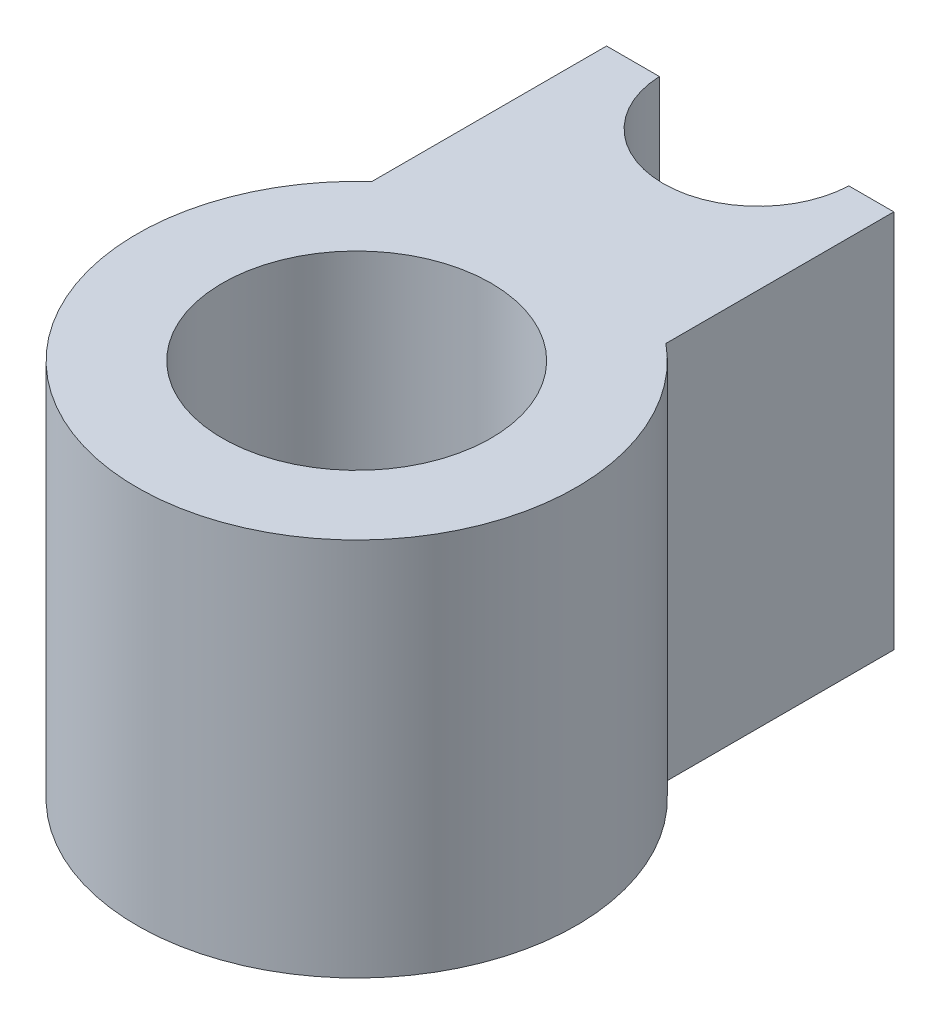
ISO-10303-21;
HEADER;
FILE_DESCRIPTION(('STEP AP214'),'2;1');
FILE_NAME('part.step','',(''),(''),'','','');
FILE_SCHEMA(('AUTOMOTIVE_DESIGN { 1 0 10303 214 1 1 1 1 }'));
ENDSEC;
DATA;
#1=APPLICATION_CONTEXT('core data for automotive mechanical design processes');
#2=APPLICATION_PROTOCOL_DEFINITION('international standard','automotive_design',2000,#1);
#3=PRODUCT_CONTEXT('',#1,'mechanical');
#4=PRODUCT('Part','Part','',(#3));
#5=PRODUCT_RELATED_PRODUCT_CATEGORY('part','',(#4));
#6=PRODUCT_DEFINITION_FORMATION('','',#4);
#7=PRODUCT_DEFINITION_CONTEXT('part definition',#1,'design');
#8=PRODUCT_DEFINITION('design','',#6,#7);
#9=PRODUCT_DEFINITION_SHAPE('','',#8);
#10=(LENGTH_UNIT() NAMED_UNIT(*) SI_UNIT(.MILLI.,.METRE.));
#11=(NAMED_UNIT(*) PLANE_ANGLE_UNIT() SI_UNIT($,.RADIAN.));
#12=(NAMED_UNIT(*) SI_UNIT($,.STERADIAN.) SOLID_ANGLE_UNIT());
#13=UNCERTAINTY_MEASURE_WITH_UNIT(LENGTH_MEASURE(1.E-05),#10,'distance_accuracy_value','');
#14=(GEOMETRIC_REPRESENTATION_CONTEXT(3) GLOBAL_UNCERTAINTY_ASSIGNED_CONTEXT((#13)) GLOBAL_UNIT_ASSIGNED_CONTEXT((#10,
#11,#12)) REPRESENTATION_CONTEXT('',''));
#15=CARTESIAN_POINT('',(0.,0.,0.));
#16=DIRECTION('',(0.,0.,1.));
#17=DIRECTION('',(1.,0.,0.));
#18=AXIS2_PLACEMENT_3D('',#15,#16,#17);
#19=CARTESIAN_POINT('',(1.26536763995187,2.87183105039429,15.59112871048));
#20=DIRECTION('',(0.,1.,0.));
#21=DIRECTION('',(0.,0.,-1.));
#22=AXIS2_PLACEMENT_3D('',#19,#20,#21);
#23=PLANE('',#22);
#24=CARTESIAN_POINT('',(8.79646763995186,2.87183105039428,7.9584287104753));
#25=DIRECTION('',(0.,1.,0.));
#26=DIRECTION('',(0.,0.,1.));
#27=AXIS2_PLACEMENT_3D('',#24,#25,#26);
#28=CIRCLE('',#27,0.425);
#29=CARTESIAN_POINT('',(8.79646763995187,2.87183105039428,7.5334287104753));
#30=VERTEX_POINT('',#29);
#31=EDGE_CURVE('E86',#30,#30,#28,.T.);
#32=ORIENTED_EDGE('',*,*,#31,.F.);
#33=EDGE_LOOP('',(#32));
#34=FACE_BOUND('',#33,.T.);
#35=DIRECTION('',(-5.02522919053297E-13,0.,1.));
#36=VECTOR('',#35,1.);
#37=CARTESIAN_POINT('',(8.32965283606923,2.87183105039428,6.70112871047543));
#38=LINE('',#37,#36);
#39=CARTESIAN_POINT('',(8.32965283606923,2.87183105039428,6.70112871047543));
#40=VERTEX_POINT('',#39);
#41=CARTESIAN_POINT('',(8.32965283606885,2.87183105039428,7.44378108328629));
#42=VERTEX_POINT('',#41);
#43=EDGE_CURVE('E101',#40,#42,#38,.T.);
#44=ORIENTED_EDGE('',*,*,#43,.T.);
#45=CARTESIAN_POINT('',(8.79646763995186,2.87183105039428,7.9584287104753));
#46=DIRECTION('',(0.,1.,0.));
#47=DIRECTION('',(0.,0.,1.));
#48=AXIS2_PLACEMENT_3D('',#45,#46,#47);
#49=CIRCLE('',#48,0.694822453073876);
#50=CARTESIAN_POINT('',(9.23834672883134,2.87183105039428,7.42221875895757));
#51=VERTEX_POINT('',#50);
#52=EDGE_CURVE('E99',#42,#51,#49,.T.);
#53=ORIENTED_EDGE('',*,*,#52,.T.);
#54=DIRECTION('',(5.6636748734305E-13,0.,1.));
#55=VECTOR('',#54,1.);
#56=CARTESIAN_POINT('',(9.23834672883093,2.87183105039428,6.70112871047504));
#57=LINE('',#56,#55);
#58=CARTESIAN_POINT('',(9.23834672883093,2.87183105039428,6.70112871047504));
#59=VERTEX_POINT('',#58);
#60=EDGE_CURVE('E26',#59,#51,#57,.T.);
#61=ORIENTED_EDGE('',*,*,#60,.F.);
#62=DIRECTION('',(-1.,0.,1.62432664225037E-12));
#63=VECTOR('',#62,1.);
#64=CARTESIAN_POINT('',(9.23834672883093,2.87183105039428,6.70112871047504));
#65=LINE('',#64,#63);
#66=CARTESIAN_POINT('',(9.0961987027398,2.87183105039428,6.70112871047519));
#67=VERTEX_POINT('',#66);
#68=EDGE_CURVE('E11',#59,#67,#65,.T.);
#69=ORIENTED_EDGE('',*,*,#68,.T.);
#70=CARTESIAN_POINT('',(8.79646763995185,2.87183105039428,6.68842871047528));
#71=DIRECTION('',(0.,1.,0.));
#72=DIRECTION('',(-0.999103542626486,0.,0.0423333333344553));
#73=AXIS2_PLACEMENT_3D('',#70,#71,#72);
#74=CIRCLE('',#73,0.299999999999992);
#75=CARTESIAN_POINT('',(8.49673657716391,2.87183105039428,6.70112871047561));
#76=VERTEX_POINT('',#75);
#77=EDGE_CURVE('E107',#76,#67,#74,.T.);
#78=ORIENTED_EDGE('',*,*,#77,.F.);
#79=DIRECTION('',(1.,0.,1.06337566312106E-12));
#80=VECTOR('',#79,1.);
#81=CARTESIAN_POINT('',(8.32965283606923,2.87183105039428,6.70112871047543));
#82=LINE('',#81,#80);
#83=EDGE_CURVE('E118',#40,#76,#82,.T.);
#84=ORIENTED_EDGE('',*,*,#83,.F.);
#85=EDGE_LOOP('',(#44,#53,#61,#69,#78,#84));
#86=FACE_BOUND('',#85,.T.);
#87=ADVANCED_FACE('F17',(#34,#86),#23,.T.);
#88=CARTESIAN_POINT('',(9.0961987027398,2.87183105039428,6.70112871047527));
#89=DIRECTION('',(-1.62432664225037E-12,0.,-1.));
#90=DIRECTION('',(-1.,0.,1.62432664225037E-12));
#91=AXIS2_PLACEMENT_3D('',#88,#89,#90);
#92=PLANE('',#91);
#93=DIRECTION('',(-1.,0.,1.62432664225037E-12));
#94=VECTOR('',#93,1.);
#95=CARTESIAN_POINT('',(5.18078317133862,1.6718310055699,6.70112871048163));
#96=LINE('',#95,#94);
#97=CARTESIAN_POINT('',(9.23834672883094,1.6718310055699,6.70112871047504));
#98=VERTEX_POINT('',#97);
#99=CARTESIAN_POINT('',(9.09619870273981,1.6718310055699,6.70112871047519));
#100=VERTEX_POINT('',#99);
#101=EDGE_CURVE('E159',#98,#100,#96,.T.);
#102=ORIENTED_EDGE('',*,*,#101,.T.);
#103=DIRECTION('',(0.,-1.,0.));
#104=VECTOR('',#103,1.);
#105=CARTESIAN_POINT('',(9.0961987027398,2.87183105039428,6.70112871047519));
#106=LINE('',#105,#104);
#107=EDGE_CURVE('E111',#67,#100,#106,.T.);
#108=ORIENTED_EDGE('',*,*,#107,.F.);
#109=ORIENTED_EDGE('',*,*,#68,.F.);
#110=DIRECTION('',(0.,-1.,0.));
#111=VECTOR('',#110,1.);
#112=CARTESIAN_POINT('',(9.23834672883093,2.87183105039428,6.70112871047504));
#113=LINE('',#112,#111);
#114=EDGE_CURVE('E127',#59,#98,#113,.T.);
#115=ORIENTED_EDGE('',*,*,#114,.T.);
#116=EDGE_LOOP('',(#102,#108,#109,#115));
#117=FACE_BOUND('',#116,.T.);
#118=ADVANCED_FACE('F193',(#117),#92,.T.);
#119=CARTESIAN_POINT('',(9.23834672883093,2.87183105039428,6.70112871047504));
#120=DIRECTION('',(1.,0.,-5.6636748734305E-13));
#121=DIRECTION('',(-5.6636748734305E-13,0.,-1.));
#122=AXIS2_PLACEMENT_3D('',#119,#120,#121);
#123=PLANE('',#122);
#124=DIRECTION('',(-5.6636748734305E-13,0.,-1.));
#125=VECTOR('',#124,1.);
#126=CARTESIAN_POINT('',(9.23834672883345,1.6718310055699,11.1461287104753));
#127=LINE('',#126,#125);
#128=CARTESIAN_POINT('',(9.23834672883134,1.6718310055699,7.42221875895757));
#129=VERTEX_POINT('',#128);
#130=EDGE_CURVE('E154',#129,#98,#127,.T.);
#131=ORIENTED_EDGE('',*,*,#130,.T.);
#132=ORIENTED_EDGE('',*,*,#114,.F.);
#133=ORIENTED_EDGE('',*,*,#60,.T.);
#134=DIRECTION('',(0.,-1.,0.));
#135=VECTOR('',#134,1.);
#136=CARTESIAN_POINT('',(9.23834672883134,2.87183105039428,7.42221875895757));
#137=LINE('',#136,#135);
#138=EDGE_CURVE('E92',#51,#129,#137,.T.);
#139=ORIENTED_EDGE('',*,*,#138,.T.);
#140=EDGE_LOOP('',(#131,#132,#133,#139));
#141=FACE_BOUND('',#140,.T.);
#142=ADVANCED_FACE('F138',(#141),#123,.T.);
#143=CARTESIAN_POINT('',(8.79646763995186,2.87183105039428,7.9584287104753));
#144=DIRECTION('',(0.,-1.,0.));
#145=DIRECTION('',(0.,0.,1.));
#146=AXIS2_PLACEMENT_3D('',#143,#144,#145);
#147=CYLINDRICAL_SURFACE('',#146,0.694822453073876);
#148=CARTESIAN_POINT('',(8.79646763995186,1.6718310055699,7.9584287104753));
#149=DIRECTION('',(0.,1.,0.));
#150=DIRECTION('',(0.,0.,1.));
#151=AXIS2_PLACEMENT_3D('',#148,#149,#150);
#152=CIRCLE('',#151,0.694822453073876);
#153=CARTESIAN_POINT('',(8.32965283606886,1.6718310055699,7.44378108328629));
#154=VERTEX_POINT('',#153);
#155=EDGE_CURVE('E147',#154,#129,#152,.T.);
#156=ORIENTED_EDGE('',*,*,#155,.T.);
#157=ORIENTED_EDGE('',*,*,#138,.F.);
#158=ORIENTED_EDGE('',*,*,#52,.F.);
#159=DIRECTION('',(0.,-1.,0.));
#160=VECTOR('',#159,1.);
#161=CARTESIAN_POINT('',(8.32965283606885,2.87183105039428,7.44378108328629));
#162=LINE('',#161,#160);
#163=EDGE_CURVE('E121',#42,#154,#162,.T.);
#164=ORIENTED_EDGE('',*,*,#163,.T.);
#165=EDGE_LOOP('',(#156,#157,#158,#164));
#166=FACE_BOUND('',#165,.T.);
#167=ADVANCED_FACE('F145',(#166),#147,.T.);
#168=CARTESIAN_POINT('',(8.79646763995186,2.87183105039428,7.9584287104753));
#169=DIRECTION('',(0.,-1.,0.));
#170=DIRECTION('',(0.,0.,1.));
#171=AXIS2_PLACEMENT_3D('',#168,#169,#170);
#172=CYLINDRICAL_SURFACE('',#171,0.425);
#173=CARTESIAN_POINT('',(8.79646763995186,1.6718310055699,7.9584287104753));
#174=DIRECTION('',(0.,-1.,0.));
#175=DIRECTION('',(0.,0.,1.));
#176=AXIS2_PLACEMENT_3D('',#173,#174,#175);
#177=CIRCLE('',#176,0.425);
#178=CARTESIAN_POINT('',(8.79646763995187,1.6718310055699,7.5334287104753));
#179=VERTEX_POINT('',#178);
#180=EDGE_CURVE('E153',#179,#179,#177,.T.);
#181=ORIENTED_EDGE('',*,*,#180,.T.);
#182=DIRECTION('',(0.,1.,0.));
#183=VECTOR('',#182,1.);
#184=CARTESIAN_POINT('',(8.79646763995186,2.87183105039428,7.5334287104753));
#185=LINE('',#184,#183);
#186=EDGE_CURVE('E89',#179,#30,#185,.T.);
#187=ORIENTED_EDGE('',*,*,#186,.T.);
#188=ORIENTED_EDGE('',*,*,#31,.T.);
#189=ORIENTED_EDGE('',*,*,#186,.F.);
#190=EDGE_LOOP('',(#181,#187,#188,#189));
#191=FACE_BOUND('',#190,.T.);
#192=ADVANCED_FACE('F88',(#191),#172,.F.);
#193=CARTESIAN_POINT('',(8.32965283606885,2.87183105039428,7.44378108328629));
#194=DIRECTION('',(-1.,0.,-5.02522919053297E-13));
#195=DIRECTION('',(-5.02522919053297E-13,0.,1.));
#196=AXIS2_PLACEMENT_3D('',#193,#194,#195);
#197=PLANE('',#196);
#198=DIRECTION('',(-5.02522919053297E-13,0.,1.));
#199=VECTOR('',#198,1.);
#200=CARTESIAN_POINT('',(8.32965283606681,1.6718310055699,11.5174548968849));
#201=LINE('',#200,#199);
#202=CARTESIAN_POINT('',(8.32965283606923,1.6718310055699,6.70112871047543));
#203=VERTEX_POINT('',#202);
#204=EDGE_CURVE('E177',#203,#154,#201,.T.);
#205=ORIENTED_EDGE('',*,*,#204,.T.);
#206=ORIENTED_EDGE('',*,*,#163,.F.);
#207=ORIENTED_EDGE('',*,*,#43,.F.);
#208=DIRECTION('',(0.,-1.,0.));
#209=VECTOR('',#208,1.);
#210=CARTESIAN_POINT('',(8.32965283606923,2.87183105039428,6.70112871047543));
#211=LINE('',#210,#209);
#212=EDGE_CURVE('E114',#40,#203,#211,.T.);
#213=ORIENTED_EDGE('',*,*,#212,.T.);
#214=EDGE_LOOP('',(#205,#206,#207,#213));
#215=FACE_BOUND('',#214,.T.);
#216=ADVANCED_FACE('F182',(#215),#197,.T.);
#217=CARTESIAN_POINT('',(8.32965283606923,2.87183105039428,6.70112871047543));
#218=DIRECTION('',(1.06337566312106E-12,0.,-1.));
#219=DIRECTION('',(0.,-1.,0.));
#220=AXIS2_PLACEMENT_3D('',#217,#218,#219);
#221=PLANE('',#220);
#222=DIRECTION('',(-1.,0.,-1.06337566312106E-12));
#223=VECTOR('',#222,1.);
#224=CARTESIAN_POINT('',(4.79751023801528,1.6718310055699,6.70112871047168));
#225=LINE('',#224,#223);
#226=CARTESIAN_POINT('',(8.49673657716392,1.6718310055699,6.70112871047561));
#227=VERTEX_POINT('',#226);
#228=EDGE_CURVE('E173',#227,#203,#225,.T.);
#229=ORIENTED_EDGE('',*,*,#228,.T.);
#230=ORIENTED_EDGE('',*,*,#212,.F.);
#231=ORIENTED_EDGE('',*,*,#83,.T.);
#232=DIRECTION('',(0.,-1.,0.));
#233=VECTOR('',#232,1.);
#234=CARTESIAN_POINT('',(8.49673657716391,2.87183105039428,6.70112871047561));
#235=LINE('',#234,#233);
#236=EDGE_CURVE('E105',#76,#227,#235,.T.);
#237=ORIENTED_EDGE('',*,*,#236,.T.);
#238=EDGE_LOOP('',(#229,#230,#231,#237));
#239=FACE_BOUND('',#238,.T.);
#240=ADVANCED_FACE('F208',(#239),#221,.T.);
#241=CARTESIAN_POINT('',(8.79646763995185,2.87183105039428,6.68842871047528));
#242=DIRECTION('',(0.,-1.,0.));
#243=DIRECTION('',(-0.999103542626486,0.,0.0423333333344553));
#244=AXIS2_PLACEMENT_3D('',#241,#242,#243);
#245=CYLINDRICAL_SURFACE('',#244,0.299999999999992);
#246=CARTESIAN_POINT('',(8.79646763995185,1.6718310055699,6.68842871047528));
#247=DIRECTION('',(0.,-1.,0.));
#248=DIRECTION('',(-0.999103542626486,0.,0.0423333333344553));
#249=AXIS2_PLACEMENT_3D('',#246,#247,#248);
#250=CIRCLE('',#249,0.299999999999992);
#251=EDGE_CURVE('E165',#100,#227,#250,.T.);
#252=ORIENTED_EDGE('',*,*,#251,.T.);
#253=ORIENTED_EDGE('',*,*,#236,.F.);
#254=ORIENTED_EDGE('',*,*,#77,.T.);
#255=ORIENTED_EDGE('',*,*,#107,.T.);
#256=EDGE_LOOP('',(#252,#253,#254,#255));
#257=FACE_BOUND('',#256,.T.);
#258=ADVANCED_FACE('F229',(#257),#245,.F.);
#259=CARTESIAN_POINT('',(1.26536763995188,1.6718310055699,15.59112871048));
#260=DIRECTION('',(0.,1.,0.));
#261=DIRECTION('',(0.,0.,-1.));
#262=AXIS2_PLACEMENT_3D('',#259,#260,#261);
#263=PLANE('',#262);
#264=ORIENTED_EDGE('',*,*,#180,.F.);
#265=EDGE_LOOP('',(#264));
#266=FACE_BOUND('',#265,.T.);
#267=ORIENTED_EDGE('',*,*,#204,.F.);
#268=ORIENTED_EDGE('',*,*,#228,.F.);
#269=ORIENTED_EDGE('',*,*,#251,.F.);
#270=ORIENTED_EDGE('',*,*,#101,.F.);
#271=ORIENTED_EDGE('',*,*,#130,.F.);
#272=ORIENTED_EDGE('',*,*,#155,.F.);
#273=EDGE_LOOP('',(#267,#268,#269,#270,#271,#272));
#274=FACE_BOUND('',#273,.T.);
#275=ADVANCED_FACE('F156',(#266,#274),#263,.F.);
#276=CLOSED_SHELL('',(#87,#118,#142,#167,#192,#216,#240,#258,#275));
#277=MANIFOLD_SOLID_BREP('B1',#276);
#278=ADVANCED_BREP_SHAPE_REPRESENTATION('',(#18,#277),#14);
#279=SHAPE_DEFINITION_REPRESENTATION(#9,#278);
ENDSEC;
END-ISO-10303-21;
